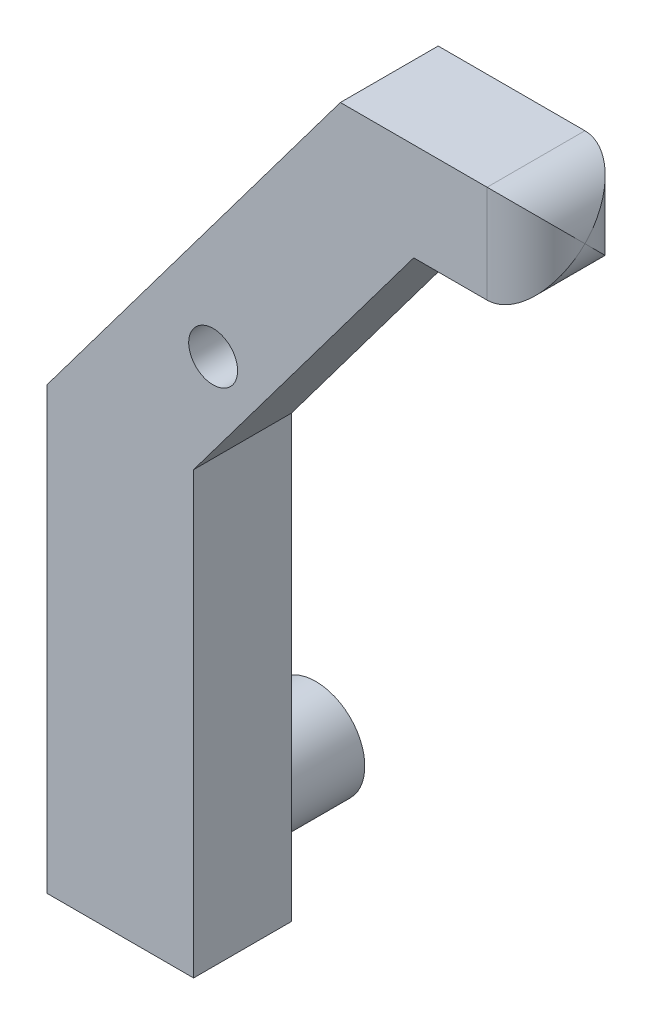
ISO-10303-21;
HEADER;
FILE_DESCRIPTION(('STEP AP214'),'2;1');
FILE_NAME('part.step','',(''),(''),'','','');
FILE_SCHEMA(('AUTOMOTIVE_DESIGN { 1 0 10303 214 1 1 1 1 }'));
ENDSEC;
DATA;
#1=APPLICATION_CONTEXT('core data for automotive mechanical design processes');
#2=APPLICATION_PROTOCOL_DEFINITION('international standard','automotive_design',2000,#1);
#3=PRODUCT_CONTEXT('',#1,'mechanical');
#4=PRODUCT('Part','Part','',(#3));
#5=PRODUCT_RELATED_PRODUCT_CATEGORY('part','',(#4));
#6=PRODUCT_DEFINITION_FORMATION('','',#4);
#7=PRODUCT_DEFINITION_CONTEXT('part definition',#1,'design');
#8=PRODUCT_DEFINITION('design','',#6,#7);
#9=PRODUCT_DEFINITION_SHAPE('','',#8);
#10=(LENGTH_UNIT() NAMED_UNIT(*) SI_UNIT(.MILLI.,.METRE.));
#11=(NAMED_UNIT(*) PLANE_ANGLE_UNIT() SI_UNIT($,.RADIAN.));
#12=(NAMED_UNIT(*) SI_UNIT($,.STERADIAN.) SOLID_ANGLE_UNIT());
#13=UNCERTAINTY_MEASURE_WITH_UNIT(LENGTH_MEASURE(1.E-05),#10,'distance_accuracy_value','');
#14=(GEOMETRIC_REPRESENTATION_CONTEXT(3) GLOBAL_UNCERTAINTY_ASSIGNED_CONTEXT((#13)) GLOBAL_UNIT_ASSIGNED_CONTEXT((#10,
#11,#12)) REPRESENTATION_CONTEXT('',''));
#15=CARTESIAN_POINT('',(0.,0.,0.));
#16=DIRECTION('',(0.,0.,1.));
#17=DIRECTION('',(1.,0.,0.));
#18=AXIS2_PLACEMENT_3D('',#15,#16,#17);
#19=CARTESIAN_POINT('',(0.,90.,20.));
#20=DIRECTION('',(-1.,0.,0.));
#21=DIRECTION('',(0.,-1.,0.));
#22=AXIS2_PLACEMENT_3D('',#19,#20,#21);
#23=PLANE('',#22);
#24=DIRECTION('',(0.,1.,0.));
#25=VECTOR('',#24,1.);
#26=CARTESIAN_POINT('',(0.,90.,0.));
#27=LINE('',#26,#25);
#28=CARTESIAN_POINT('',(0.,0.,0.));
#29=VERTEX_POINT('',#28);
#30=CARTESIAN_POINT('',(0.,90.,0.));
#31=VERTEX_POINT('',#30);
#32=EDGE_CURVE('E134',#29,#31,#27,.T.);
#33=ORIENTED_EDGE('',*,*,#32,.T.);
#34=DIRECTION('',(0.,0.,-1.));
#35=VECTOR('',#34,1.);
#36=CARTESIAN_POINT('',(0.,90.,20.));
#37=LINE('',#36,#35);
#38=CARTESIAN_POINT('',(0.,90.,20.));
#39=VERTEX_POINT('',#38);
#40=EDGE_CURVE('E114',#39,#31,#37,.T.);
#41=ORIENTED_EDGE('',*,*,#40,.F.);
#42=DIRECTION('',(0.,1.,0.));
#43=VECTOR('',#42,1.);
#44=CARTESIAN_POINT('',(0.,90.,20.));
#45=LINE('',#44,#43);
#46=CARTESIAN_POINT('',(0.,0.,20.));
#47=VERTEX_POINT('',#46);
#48=EDGE_CURVE('E121',#47,#39,#45,.T.);
#49=ORIENTED_EDGE('',*,*,#48,.F.);
#50=DIRECTION('',(0.,0.,-1.));
#51=VECTOR('',#50,1.);
#52=CARTESIAN_POINT('',(0.,0.,20.));
#53=LINE('',#52,#51);
#54=EDGE_CURVE('E193',#47,#29,#53,.T.);
#55=ORIENTED_EDGE('',*,*,#54,.T.);
#56=EDGE_LOOP('',(#33,#41,#49,#55));
#57=FACE_BOUND('',#56,.T.);
#58=ADVANCED_FACE('F45',(#57),#23,.F.);
#59=CARTESIAN_POINT('',(45.0000000000001,150.,20.));
#60=DIRECTION('',(-0.799999999999999,0.600000000000001,0.));
#61=DIRECTION('',(-0.600000000000001,-0.799999999999999,0.));
#62=AXIS2_PLACEMENT_3D('',#59,#60,#61);
#63=PLANE('',#62);
#64=DIRECTION('',(0.600000000000001,0.799999999999999,0.));
#65=VECTOR('',#64,1.);
#66=CARTESIAN_POINT('',(45.0000000000001,150.,0.));
#67=LINE('',#66,#65);
#68=CARTESIAN_POINT('',(45.0000000000001,150.,0.));
#69=VERTEX_POINT('',#68);
#70=EDGE_CURVE('E171',#31,#69,#67,.T.);
#71=ORIENTED_EDGE('',*,*,#70,.T.);
#72=DIRECTION('',(0.,0.,-1.));
#73=VECTOR('',#72,1.);
#74=CARTESIAN_POINT('',(45.0000000000001,150.,20.));
#75=LINE('',#74,#73);
#76=CARTESIAN_POINT('',(45.0000000000001,150.,20.));
#77=VERTEX_POINT('',#76);
#78=EDGE_CURVE('E117',#77,#69,#75,.T.);
#79=ORIENTED_EDGE('',*,*,#78,.F.);
#80=DIRECTION('',(0.600000000000001,0.799999999999999,0.));
#81=VECTOR('',#80,1.);
#82=CARTESIAN_POINT('',(45.0000000000001,150.,20.));
#83=LINE('',#82,#81);
#84=EDGE_CURVE('E110',#39,#77,#83,.T.);
#85=ORIENTED_EDGE('',*,*,#84,.F.);
#86=ORIENTED_EDGE('',*,*,#40,.T.);
#87=EDGE_LOOP('',(#71,#79,#85,#86));
#88=FACE_BOUND('',#87,.T.);
#89=ADVANCED_FACE('F112',(#88),#63,.F.);
#90=CARTESIAN_POINT('',(70.,150.,20.));
#91=DIRECTION('',(0.,1.,0.));
#92=DIRECTION('',(-1.,0.,0.));
#93=AXIS2_PLACEMENT_3D('',#90,#91,#92);
#94=PLANE('',#93);
#95=DIRECTION('',(1.,0.,0.));
#96=VECTOR('',#95,1.);
#97=CARTESIAN_POINT('',(70.,150.,0.));
#98=LINE('',#97,#96);
#99=CARTESIAN_POINT('',(60.,150.,0.));
#100=VERTEX_POINT('',#99);
#101=EDGE_CURVE('E174',#69,#100,#98,.T.);
#102=ORIENTED_EDGE('',*,*,#101,.T.);
#103=DIRECTION('',(0.,0.,-1.));
#104=VECTOR('',#103,1.);
#105=CARTESIAN_POINT('',(60.,150.,20.));
#106=LINE('',#105,#104);
#107=CARTESIAN_POINT('',(60.,150.,20.));
#108=VERTEX_POINT('',#107);
#109=EDGE_CURVE('E136',#100,#108,#106,.F.);
#110=ORIENTED_EDGE('',*,*,#109,.T.);
#111=DIRECTION('',(1.,0.,0.));
#112=VECTOR('',#111,1.);
#113=CARTESIAN_POINT('',(70.,150.,20.));
#114=LINE('',#113,#112);
#115=EDGE_CURVE('E120',#77,#108,#114,.T.);
#116=ORIENTED_EDGE('',*,*,#115,.F.);
#117=ORIENTED_EDGE('',*,*,#78,.T.);
#118=EDGE_LOOP('',(#102,#110,#116,#117));
#119=FACE_BOUND('',#118,.T.);
#120=ADVANCED_FACE('F275',(#119),#94,.F.);
#121=CARTESIAN_POINT('',(30.0000000000001,170.,20.));
#122=DIRECTION('',(0.,-1.,0.));
#123=DIRECTION('',(0.,0.,-1.));
#124=AXIS2_PLACEMENT_3D('',#121,#122,#123);
#125=PLANE('',#124);
#126=DIRECTION('',(-1.,0.,0.));
#127=VECTOR('',#126,1.);
#128=CARTESIAN_POINT('',(30.0000000000001,170.,20.));
#129=LINE('',#128,#127);
#130=CARTESIAN_POINT('',(60.,170.,20.));
#131=VERTEX_POINT('',#130);
#132=CARTESIAN_POINT('',(30.0000000000001,170.,20.));
#133=VERTEX_POINT('',#132);
#134=EDGE_CURVE('E228',#131,#133,#129,.T.);
#135=ORIENTED_EDGE('',*,*,#134,.F.);
#136=DIRECTION('',(0.,0.,-1.));
#137=VECTOR('',#136,1.);
#138=CARTESIAN_POINT('',(60.,170.,20.));
#139=LINE('',#138,#137);
#140=CARTESIAN_POINT('',(60.,170.,0.));
#141=VERTEX_POINT('',#140);
#142=EDGE_CURVE('E56',#131,#141,#139,.T.);
#143=ORIENTED_EDGE('',*,*,#142,.T.);
#144=DIRECTION('',(-1.,0.,0.));
#145=VECTOR('',#144,1.);
#146=CARTESIAN_POINT('',(30.0000000000001,170.,0.));
#147=LINE('',#146,#145);
#148=CARTESIAN_POINT('',(30.0000000000001,170.,0.));
#149=VERTEX_POINT('',#148);
#150=EDGE_CURVE('E182',#141,#149,#147,.T.);
#151=ORIENTED_EDGE('',*,*,#150,.T.);
#152=DIRECTION('',(0.,0.,-1.));
#153=VECTOR('',#152,1.);
#154=CARTESIAN_POINT('',(30.0000000000001,170.,20.));
#155=LINE('',#154,#153);
#156=EDGE_CURVE('E143',#133,#149,#155,.T.);
#157=ORIENTED_EDGE('',*,*,#156,.F.);
#158=EDGE_LOOP('',(#135,#143,#151,#157));
#159=FACE_BOUND('',#158,.T.);
#160=ADVANCED_FACE('F300',(#159),#125,.F.);
#161=CARTESIAN_POINT('',(-30.,90.,20.));
#162=DIRECTION('',(0.799999999999999,-0.600000000000001,0.));
#163=DIRECTION('',(0.600000000000001,0.799999999999999,0.));
#164=AXIS2_PLACEMENT_3D('',#161,#162,#163);
#165=PLANE('',#164);
#166=DIRECTION('',(-0.600000000000001,-0.799999999999999,0.));
#167=VECTOR('',#166,1.);
#168=CARTESIAN_POINT('',(-30.,90.,0.));
#169=LINE('',#168,#167);
#170=CARTESIAN_POINT('',(-30.,90.,0.));
#171=VERTEX_POINT('',#170);
#172=EDGE_CURVE('E185',#149,#171,#169,.T.);
#173=ORIENTED_EDGE('',*,*,#172,.T.);
#174=DIRECTION('',(0.,0.,-1.));
#175=VECTOR('',#174,1.);
#176=CARTESIAN_POINT('',(-30.,90.,20.));
#177=LINE('',#176,#175);
#178=CARTESIAN_POINT('',(-30.,90.,20.));
#179=VERTEX_POINT('',#178);
#180=EDGE_CURVE('E200',#179,#171,#177,.T.);
#181=ORIENTED_EDGE('',*,*,#180,.F.);
#182=DIRECTION('',(-0.600000000000001,-0.799999999999999,0.));
#183=VECTOR('',#182,1.);
#184=CARTESIAN_POINT('',(-30.,90.,20.));
#185=LINE('',#184,#183);
#186=EDGE_CURVE('E211',#133,#179,#185,.T.);
#187=ORIENTED_EDGE('',*,*,#186,.F.);
#188=ORIENTED_EDGE('',*,*,#156,.T.);
#189=EDGE_LOOP('',(#173,#181,#187,#188));
#190=FACE_BOUND('',#189,.T.);
#191=ADVANCED_FACE('F209',(#190),#165,.F.);
#192=CARTESIAN_POINT('',(-30.,0.,20.));
#193=DIRECTION('',(1.,0.,0.));
#194=DIRECTION('',(0.,0.,-1.));
#195=AXIS2_PLACEMENT_3D('',#192,#193,#194);
#196=PLANE('',#195);
#197=DIRECTION('',(0.,-1.,0.));
#198=VECTOR('',#197,1.);
#199=CARTESIAN_POINT('',(-30.,0.,0.));
#200=LINE('',#199,#198);
#201=CARTESIAN_POINT('',(-30.,0.,0.));
#202=VERTEX_POINT('',#201);
#203=EDGE_CURVE('E188',#171,#202,#200,.T.);
#204=ORIENTED_EDGE('',*,*,#203,.T.);
#205=DIRECTION('',(0.,0.,-1.));
#206=VECTOR('',#205,1.);
#207=CARTESIAN_POINT('',(-30.,0.,20.));
#208=LINE('',#207,#206);
#209=CARTESIAN_POINT('',(-30.,0.,20.));
#210=VERTEX_POINT('',#209);
#211=EDGE_CURVE('E196',#210,#202,#208,.T.);
#212=ORIENTED_EDGE('',*,*,#211,.F.);
#213=DIRECTION('',(0.,-1.,0.));
#214=VECTOR('',#213,1.);
#215=CARTESIAN_POINT('',(-30.,0.,20.));
#216=LINE('',#215,#214);
#217=EDGE_CURVE('E225',#179,#210,#216,.T.);
#218=ORIENTED_EDGE('',*,*,#217,.F.);
#219=ORIENTED_EDGE('',*,*,#180,.T.);
#220=EDGE_LOOP('',(#204,#212,#218,#219));
#221=FACE_BOUND('',#220,.T.);
#222=ADVANCED_FACE('F220',(#221),#196,.F.);
#223=CARTESIAN_POINT('',(0.,0.,20.));
#224=DIRECTION('',(0.,1.,0.));
#225=DIRECTION('',(-1.,0.,0.));
#226=AXIS2_PLACEMENT_3D('',#223,#224,#225);
#227=PLANE('',#226);
#228=DIRECTION('',(1.,0.,0.));
#229=VECTOR('',#228,1.);
#230=CARTESIAN_POINT('',(0.,0.,0.));
#231=LINE('',#230,#229);
#232=EDGE_CURVE('E131',#202,#29,#231,.T.);
#233=ORIENTED_EDGE('',*,*,#232,.T.);
#234=ORIENTED_EDGE('',*,*,#54,.F.);
#235=DIRECTION('',(1.,0.,0.));
#236=VECTOR('',#235,1.);
#237=CARTESIAN_POINT('',(0.,0.,20.));
#238=LINE('',#237,#236);
#239=EDGE_CURVE('E126',#210,#47,#238,.T.);
#240=ORIENTED_EDGE('',*,*,#239,.F.);
#241=ORIENTED_EDGE('',*,*,#211,.T.);
#242=EDGE_LOOP('',(#233,#234,#240,#241));
#243=FACE_BOUND('',#242,.T.);
#244=ADVANCED_FACE('F223',(#243),#227,.F.);
#245=CARTESIAN_POINT('',(0.,0.,20.));
#246=DIRECTION('',(0.,0.,-1.));
#247=DIRECTION('',(-1.,0.,0.));
#248=AXIS2_PLACEMENT_3D('',#245,#246,#247);
#249=PLANE('',#248);
#250=CARTESIAN_POINT('',(4.00000000000003,112.,20.));
#251=DIRECTION('',(0.,0.,1.));
#252=DIRECTION('',(1.,0.,0.));
#253=AXIS2_PLACEMENT_3D('',#250,#251,#252);
#254=CIRCLE('',#253,5.00000000000001);
#255=CARTESIAN_POINT('',(9.00000000000004,112.,20.));
#256=VERTEX_POINT('',#255);
#257=EDGE_CURVE('E243',#256,#256,#254,.T.);
#258=ORIENTED_EDGE('',*,*,#257,.F.);
#259=EDGE_LOOP('',(#258));
#260=FACE_BOUND('',#259,.T.);
#261=ORIENTED_EDGE('',*,*,#115,.T.);
#262=DIRECTION('',(0.,1.,0.));
#263=VECTOR('',#262,1.);
#264=CARTESIAN_POINT('',(60.,0.,20.));
#265=LINE('',#264,#263);
#266=EDGE_CURVE('E11',#108,#131,#265,.T.);
#267=ORIENTED_EDGE('',*,*,#266,.T.);
#268=ORIENTED_EDGE('',*,*,#134,.T.);
#269=ORIENTED_EDGE('',*,*,#186,.T.);
#270=ORIENTED_EDGE('',*,*,#217,.T.);
#271=ORIENTED_EDGE('',*,*,#239,.T.);
#272=ORIENTED_EDGE('',*,*,#48,.T.);
#273=ORIENTED_EDGE('',*,*,#84,.T.);
#274=EDGE_LOOP('',(#261,#267,#268,#269,#270,#271,#272,#273));
#275=FACE_BOUND('',#274,.T.);
#276=ADVANCED_FACE('F124',(#260,#275),#249,.F.);
#277=CARTESIAN_POINT('',(0.,0.,0.));
#278=DIRECTION('',(0.,0.,-1.));
#279=DIRECTION('',(-1.,0.,0.));
#280=AXIS2_PLACEMENT_3D('',#277,#278,#279);
#281=PLANE('',#280);
#282=CARTESIAN_POINT('',(4.00000000000003,112.,0.));
#283=DIRECTION('',(0.,0.,1.));
#284=DIRECTION('',(1.,0.,0.));
#285=AXIS2_PLACEMENT_3D('',#282,#283,#284);
#286=CIRCLE('',#285,5.00000000000001);
#287=CARTESIAN_POINT('',(9.00000000000004,112.,0.));
#288=VERTEX_POINT('',#287);
#289=EDGE_CURVE('E239',#288,#288,#286,.T.);
#290=ORIENTED_EDGE('',*,*,#289,.T.);
#291=EDGE_LOOP('',(#290));
#292=FACE_BOUND('',#291,.T.);
#293=CARTESIAN_POINT('',(-15.,15.,0.));
#294=DIRECTION('',(0.,0.,-1.));
#295=DIRECTION('',(-1.,0.,0.));
#296=AXIS2_PLACEMENT_3D('',#293,#294,#295);
#297=CIRCLE('',#296,10.);
#298=CARTESIAN_POINT('',(-25.,15.,0.));
#299=VERTEX_POINT('',#298);
#300=EDGE_CURVE('E235',#299,#299,#297,.T.);
#301=ORIENTED_EDGE('',*,*,#300,.F.);
#302=EDGE_LOOP('',(#301));
#303=FACE_BOUND('',#302,.T.);
#304=ORIENTED_EDGE('',*,*,#150,.F.);
#305=DIRECTION('',(0.,1.,0.));
#306=VECTOR('',#305,1.);
#307=CARTESIAN_POINT('',(60.,150.,0.));
#308=LINE('',#307,#306);
#309=EDGE_CURVE('E141',#141,#100,#308,.F.);
#310=ORIENTED_EDGE('',*,*,#309,.T.);
#311=ORIENTED_EDGE('',*,*,#101,.F.);
#312=ORIENTED_EDGE('',*,*,#70,.F.);
#313=ORIENTED_EDGE('',*,*,#32,.F.);
#314=ORIENTED_EDGE('',*,*,#232,.F.);
#315=ORIENTED_EDGE('',*,*,#203,.F.);
#316=ORIENTED_EDGE('',*,*,#172,.F.);
#317=EDGE_LOOP('',(#304,#310,#311,#312,#313,#314,#315,#316));
#318=FACE_BOUND('',#317,.T.);
#319=ADVANCED_FACE('F216',(#292,#303,#318),#281,.T.);
#320=CARTESIAN_POINT('',(60.,160.,20.));
#321=DIRECTION('',(0.,0.,-1.));
#322=DIRECTION('',(-1.,0.,0.));
#323=AXIS2_PLACEMENT_3D('',#320,#321,#322);
#324=CYLINDRICAL_SURFACE('',#323,10.);
#325=CARTESIAN_POINT('',(60.,160.,10.));
#326=DIRECTION('',(0.,-0.707106781186547,-0.707106781186547));
#327=DIRECTION('',(0.,0.707106781186547,-0.707106781186547));
#328=AXIS2_PLACEMENT_3D('',#325,#326,#327);
#329=ELLIPSE('',#328,14.1421356237309,10.);
#330=CARTESIAN_POINT('',(70.,160.,10.));
#331=VERTEX_POINT('',#330);
#332=EDGE_CURVE('E158',#141,#331,#329,.T.);
#333=ORIENTED_EDGE('',*,*,#332,.F.);
#334=ORIENTED_EDGE('',*,*,#142,.F.);
#335=CARTESIAN_POINT('',(60.,160.,10.));
#336=DIRECTION('',(0.,0.707106781186547,-0.707106781186547));
#337=DIRECTION('',(0.,0.707106781186547,0.707106781186547));
#338=AXIS2_PLACEMENT_3D('',#335,#336,#337);
#339=ELLIPSE('',#338,14.1421356237309,10.);
#340=EDGE_CURVE('E49',#331,#131,#339,.F.);
#341=ORIENTED_EDGE('',*,*,#340,.F.);
#342=EDGE_LOOP('',(#333,#334,#341));
#343=FACE_BOUND('',#342,.T.);
#344=ADVANCED_FACE('F47',(#343),#324,.T.);
#345=CARTESIAN_POINT('',(60.,0.,10.));
#346=DIRECTION('',(0.,1.,0.));
#347=DIRECTION('',(0.,0.,1.));
#348=AXIS2_PLACEMENT_3D('',#345,#346,#347);
#349=CYLINDRICAL_SURFACE('',#348,10.);
#350=ORIENTED_EDGE('',*,*,#340,.T.);
#351=ORIENTED_EDGE('',*,*,#266,.F.);
#352=CARTESIAN_POINT('',(60.,160.,10.));
#353=DIRECTION('',(0.,0.707106781186547,0.707106781186547));
#354=DIRECTION('',(0.,0.707106781186547,-0.707106781186547));
#355=AXIS2_PLACEMENT_3D('',#352,#353,#354);
#356=ELLIPSE('',#355,14.1421356237309,10.);
#357=EDGE_CURVE('E155',#331,#108,#356,.F.);
#358=ORIENTED_EDGE('',*,*,#357,.F.);
#359=EDGE_LOOP('',(#350,#351,#358));
#360=FACE_BOUND('',#359,.T.);
#361=ADVANCED_FACE('F286',(#360),#349,.T.);
#362=CARTESIAN_POINT('',(60.,170.,10.));
#363=DIRECTION('',(0.,-1.,0.));
#364=DIRECTION('',(0.,0.,-1.));
#365=AXIS2_PLACEMENT_3D('',#362,#363,#364);
#366=CYLINDRICAL_SURFACE('',#365,10.);
#367=ORIENTED_EDGE('',*,*,#309,.F.);
#368=ORIENTED_EDGE('',*,*,#332,.T.);
#369=CARTESIAN_POINT('',(60.,160.,10.));
#370=DIRECTION('',(0.,-0.707106781186547,0.707106781186547));
#371=DIRECTION('',(0.,-0.707106781186547,-0.707106781186547));
#372=AXIS2_PLACEMENT_3D('',#369,#370,#371);
#373=ELLIPSE('',#372,14.1421356237309,10.);
#374=EDGE_CURVE('E151',#100,#331,#373,.T.);
#375=ORIENTED_EDGE('',*,*,#374,.F.);
#376=EDGE_LOOP('',(#367,#368,#375));
#377=FACE_BOUND('',#376,.T.);
#378=ADVANCED_FACE('F283',(#377),#366,.T.);
#379=CARTESIAN_POINT('',(60.,160.,20.));
#380=DIRECTION('',(0.,0.,-1.));
#381=DIRECTION('',(-1.,0.,0.));
#382=AXIS2_PLACEMENT_3D('',#379,#380,#381);
#383=CYLINDRICAL_SURFACE('',#382,10.);
#384=ORIENTED_EDGE('',*,*,#357,.T.);
#385=ORIENTED_EDGE('',*,*,#109,.F.);
#386=ORIENTED_EDGE('',*,*,#374,.T.);
#387=EDGE_LOOP('',(#384,#385,#386));
#388=FACE_BOUND('',#387,.T.);
#389=ADVANCED_FACE('F279',(#388),#383,.T.);
#390=CARTESIAN_POINT('',(-15.,15.,-20.));
#391=DIRECTION('',(0.,0.,1.));
#392=DIRECTION('',(1.,0.,0.));
#393=AXIS2_PLACEMENT_3D('',#390,#391,#392);
#394=CYLINDRICAL_SURFACE('',#393,10.);
#395=CARTESIAN_POINT('',(-15.,15.,-20.));
#396=DIRECTION('',(0.,0.,-1.));
#397=DIRECTION('',(-1.,0.,0.));
#398=AXIS2_PLACEMENT_3D('',#395,#396,#397);
#399=CIRCLE('',#398,10.);
#400=CARTESIAN_POINT('',(-25.,15.,-20.));
#401=VERTEX_POINT('',#400);
#402=EDGE_CURVE('E156',#401,#401,#399,.T.);
#403=ORIENTED_EDGE('',*,*,#402,.F.);
#404=EDGE_LOOP('',(#403));
#405=FACE_BOUND('',#404,.T.);
#406=ORIENTED_EDGE('',*,*,#300,.T.);
#407=EDGE_LOOP('',(#406));
#408=FACE_BOUND('',#407,.T.);
#409=ADVANCED_FACE('F282',(#405,#408),#394,.T.);
#410=CARTESIAN_POINT('',(0.,0.,-20.));
#411=DIRECTION('',(0.,0.,-1.));
#412=DIRECTION('',(-1.,0.,0.));
#413=AXIS2_PLACEMENT_3D('',#410,#411,#412);
#414=PLANE('',#413);
#415=ORIENTED_EDGE('',*,*,#402,.T.);
#416=EDGE_LOOP('',(#415));
#417=FACE_BOUND('',#416,.T.);
#418=ADVANCED_FACE('F256',(#417),#414,.T.);
#419=CARTESIAN_POINT('',(4.00000000000003,112.,0.));
#420=DIRECTION('',(0.,0.,1.));
#421=DIRECTION('',(1.,0.,0.));
#422=AXIS2_PLACEMENT_3D('',#419,#420,#421);
#423=CYLINDRICAL_SURFACE('',#422,5.00000000000001);
#424=ORIENTED_EDGE('',*,*,#289,.F.);
#425=EDGE_LOOP('',(#424));
#426=FACE_BOUND('',#425,.T.);
#427=ORIENTED_EDGE('',*,*,#257,.T.);
#428=EDGE_LOOP('',(#427));
#429=FACE_BOUND('',#428,.T.);
#430=ADVANCED_FACE('F253',(#426,#429),#423,.F.);
#431=CLOSED_SHELL('',(#58,#89,#120,#160,#191,#222,#244,#276,#319,#344,#361,#378,#389,#409,#418,#430));
#432=MANIFOLD_SOLID_BREP('B2',#431);
#433=ADVANCED_BREP_SHAPE_REPRESENTATION('',(#18,#432),#14);
#434=SHAPE_DEFINITION_REPRESENTATION(#9,#433);
ENDSEC;
END-ISO-10303-21;
